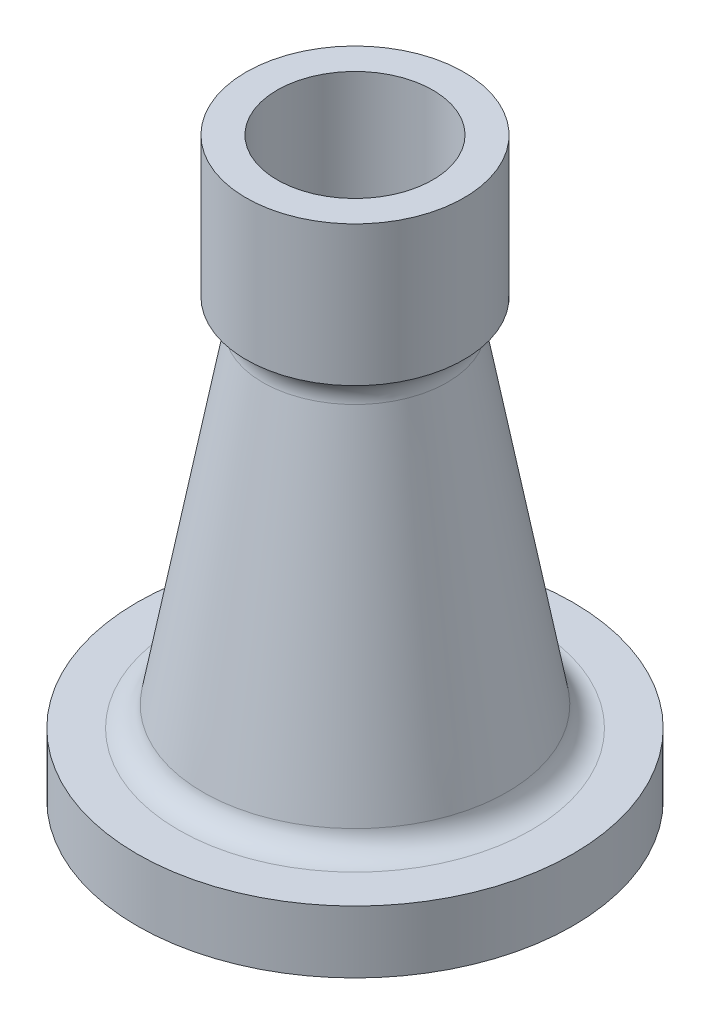
ISO-10303-21;
HEADER;
FILE_DESCRIPTION(('STEP AP214'),'2;1');
FILE_NAME('part.step','',(''),(''),'','','');
FILE_SCHEMA(('AUTOMOTIVE_DESIGN { 1 0 10303 214 1 1 1 1 }'));
ENDSEC;
DATA;
#1=APPLICATION_CONTEXT('core data for automotive mechanical design processes');
#2=APPLICATION_PROTOCOL_DEFINITION('international standard','automotive_design',2000,#1);
#3=PRODUCT_CONTEXT('',#1,'mechanical');
#4=PRODUCT('Part','Part','',(#3));
#5=PRODUCT_RELATED_PRODUCT_CATEGORY('part','',(#4));
#6=PRODUCT_DEFINITION_FORMATION('','',#4);
#7=PRODUCT_DEFINITION_CONTEXT('part definition',#1,'design');
#8=PRODUCT_DEFINITION('design','',#6,#7);
#9=PRODUCT_DEFINITION_SHAPE('','',#8);
#10=(LENGTH_UNIT() NAMED_UNIT(*) SI_UNIT(.MILLI.,.METRE.));
#11=(NAMED_UNIT(*) PLANE_ANGLE_UNIT() SI_UNIT($,.RADIAN.));
#12=(NAMED_UNIT(*) SI_UNIT($,.STERADIAN.) SOLID_ANGLE_UNIT());
#13=UNCERTAINTY_MEASURE_WITH_UNIT(LENGTH_MEASURE(1.E-05),#10,'distance_accuracy_value','');
#14=(GEOMETRIC_REPRESENTATION_CONTEXT(3) GLOBAL_UNCERTAINTY_ASSIGNED_CONTEXT((#13)) GLOBAL_UNIT_ASSIGNED_CONTEXT((#10,
#11,#12)) REPRESENTATION_CONTEXT('',''));
#15=CARTESIAN_POINT('',(0.,0.,0.));
#16=DIRECTION('',(0.,0.,1.));
#17=DIRECTION('',(1.,0.,0.));
#18=AXIS2_PLACEMENT_3D('',#15,#16,#17);
#19=CARTESIAN_POINT('',(25.,92.5,0.));
#20=DIRECTION('',(0.,-1.,0.));
#21=DIRECTION('',(1.,0.,0.));
#22=AXIS2_PLACEMENT_3D('',#19,#20,#21);
#23=PLANE('',#22);
#24=CARTESIAN_POINT('',(0.,92.5,0.));
#25=DIRECTION('',(0.,1.,0.));
#26=DIRECTION('',(-1.,0.,0.));
#27=AXIS2_PLACEMENT_3D('',#24,#25,#26);
#28=CIRCLE('',#27,25.);
#29=CARTESIAN_POINT('',(-25.,92.5,0.));
#30=VERTEX_POINT('',#29);
#31=EDGE_CURVE('E10',#30,#30,#28,.T.);
#32=ORIENTED_EDGE('',*,*,#31,.F.);
#33=EDGE_LOOP('',(#32));
#34=FACE_BOUND('',#33,.T.);
#35=CARTESIAN_POINT('',(0.,92.5,0.));
#36=DIRECTION('',(0.,1.,0.));
#37=DIRECTION('',(-1.,0.,0.));
#38=AXIS2_PLACEMENT_3D('',#35,#36,#37);
#39=CIRCLE('',#38,35.);
#40=CARTESIAN_POINT('',(-35.,92.5,0.));
#41=VERTEX_POINT('',#40);
#42=EDGE_CURVE('E95',#41,#41,#39,.T.);
#43=ORIENTED_EDGE('',*,*,#42,.T.);
#44=EDGE_LOOP('',(#43));
#45=FACE_BOUND('',#44,.T.);
#46=ADVANCED_FACE('F40',(#34,#45),#23,.F.);
#47=CARTESIAN_POINT('',(0.,92.5,0.));
#48=DIRECTION('',(0.,1.,0.));
#49=DIRECTION('',(-1.,0.,0.));
#50=AXIS2_PLACEMENT_3D('',#47,#48,#49);
#51=CYLINDRICAL_SURFACE('',#50,25.);
#52=CARTESIAN_POINT('',(0.,8.21170713984311,0.));
#53=DIRECTION('',(0.,1.,0.));
#54=DIRECTION('',(-1.,0.,0.));
#55=AXIS2_PLACEMENT_3D('',#52,#53,#54);
#56=CIRCLE('',#55,25.);
#57=CARTESIAN_POINT('',(-25.,8.21170713984311,0.));
#58=VERTEX_POINT('',#57);
#59=EDGE_CURVE('E47',#58,#58,#56,.T.);
#60=ORIENTED_EDGE('',*,*,#59,.F.);
#61=EDGE_LOOP('',(#60));
#62=FACE_BOUND('',#61,.T.);
#63=ORIENTED_EDGE('',*,*,#31,.T.);
#64=EDGE_LOOP('',(#63));
#65=FACE_BOUND('',#64,.T.);
#66=ADVANCED_FACE('F163',(#62,#65),#51,.F.);
#67=CARTESIAN_POINT('',(0.,8.21170713984311,0.));
#68=DIRECTION('',(0.,-1.,0.));
#69=DIRECTION('',(1.,0.,0.));
#70=AXIS2_PLACEMENT_3D('',#67,#68,#69);
#71=CONICAL_SURFACE('',#70,25.,0.181744020724218);
#72=CARTESIAN_POINT('',(0.,-89.5,0.));
#73=DIRECTION('',(0.,1.,0.));
#74=DIRECTION('',(-1.,0.,0.));
#75=AXIS2_PLACEMENT_3D('',#72,#73,#74);
#76=CIRCLE('',#75,42.9566634528639);
#77=CARTESIAN_POINT('',(-42.9566634528639,-89.5,0.));
#78=VERTEX_POINT('',#77);
#79=EDGE_CURVE('E52',#78,#78,#76,.T.);
#80=ORIENTED_EDGE('',*,*,#79,.F.);
#81=EDGE_LOOP('',(#80));
#82=FACE_BOUND('',#81,.T.);
#83=ORIENTED_EDGE('',*,*,#59,.T.);
#84=EDGE_LOOP('',(#83));
#85=FACE_BOUND('',#84,.T.);
#86=ADVANCED_FACE('F158',(#82,#85),#71,.F.);
#87=CARTESIAN_POINT('',(47.5,-89.5,0.));
#88=DIRECTION('',(0.,1.,0.));
#89=DIRECTION('',(-1.,0.,0.));
#90=AXIS2_PLACEMENT_3D('',#87,#88,#89);
#91=PLANE('',#90);
#92=CARTESIAN_POINT('',(0.,-89.5,0.));
#93=DIRECTION('',(0.,1.,0.));
#94=DIRECTION('',(-1.,0.,0.));
#95=AXIS2_PLACEMENT_3D('',#92,#93,#94);
#96=CIRCLE('',#95,47.5);
#97=CARTESIAN_POINT('',(-47.5,-89.5,0.));
#98=VERTEX_POINT('',#97);
#99=EDGE_CURVE('E57',#98,#98,#96,.T.);
#100=ORIENTED_EDGE('',*,*,#99,.F.);
#101=EDGE_LOOP('',(#100));
#102=FACE_BOUND('',#101,.T.);
#103=ORIENTED_EDGE('',*,*,#79,.T.);
#104=EDGE_LOOP('',(#103));
#105=FACE_BOUND('',#104,.T.);
#106=ADVANCED_FACE('F152',(#102,#105),#91,.F.);
#107=CARTESIAN_POINT('',(0.,-92.,0.));
#108=DIRECTION('',(0.,1.,0.));
#109=DIRECTION('',(-1.,0.,0.));
#110=AXIS2_PLACEMENT_3D('',#107,#108,#109);
#111=TOROIDAL_SURFACE('',#110,47.5,2.5);
#112=CARTESIAN_POINT('',(0.,-92.,0.));
#113=DIRECTION('',(0.,1.,0.));
#114=DIRECTION('',(-1.,0.,0.));
#115=AXIS2_PLACEMENT_3D('',#112,#113,#114);
#116=CIRCLE('',#115,50.);
#117=CARTESIAN_POINT('',(-50.,-92.,0.));
#118=VERTEX_POINT('',#117);
#119=EDGE_CURVE('E63',#118,#118,#116,.T.);
#120=ORIENTED_EDGE('',*,*,#119,.F.);
#121=EDGE_LOOP('',(#120));
#122=FACE_BOUND('',#121,.T.);
#123=ORIENTED_EDGE('',*,*,#99,.T.);
#124=EDGE_LOOP('',(#123));
#125=FACE_BOUND('',#124,.T.);
#126=ADVANCED_FACE('F146',(#122,#125),#111,.F.);
#127=CARTESIAN_POINT('',(0.,92.5,0.));
#128=DIRECTION('',(0.,1.,0.));
#129=DIRECTION('',(-1.,0.,0.));
#130=AXIS2_PLACEMENT_3D('',#127,#128,#129);
#131=CYLINDRICAL_SURFACE('',#130,50.);
#132=CARTESIAN_POINT('',(0.,-92.5,0.));
#133=DIRECTION('',(0.,1.,0.));
#134=DIRECTION('',(-1.,0.,0.));
#135=AXIS2_PLACEMENT_3D('',#132,#133,#134);
#136=CIRCLE('',#135,50.);
#137=CARTESIAN_POINT('',(-50.,-92.5,0.));
#138=VERTEX_POINT('',#137);
#139=EDGE_CURVE('E67',#138,#138,#136,.T.);
#140=ORIENTED_EDGE('',*,*,#139,.F.);
#141=EDGE_LOOP('',(#140));
#142=FACE_BOUND('',#141,.T.);
#143=ORIENTED_EDGE('',*,*,#119,.T.);
#144=EDGE_LOOP('',(#143));
#145=FACE_BOUND('',#144,.T.);
#146=ADVANCED_FACE('F140',(#142,#145),#131,.F.);
#147=CARTESIAN_POINT('',(50.,-92.5,0.));
#148=DIRECTION('',(0.,1.,0.));
#149=DIRECTION('',(-1.,0.,0.));
#150=AXIS2_PLACEMENT_3D('',#147,#148,#149);
#151=PLANE('',#150);
#152=CARTESIAN_POINT('',(0.,-92.5,0.));
#153=DIRECTION('',(0.,1.,0.));
#154=DIRECTION('',(-1.,0.,0.));
#155=AXIS2_PLACEMENT_3D('',#152,#153,#154);
#156=CIRCLE('',#155,70.);
#157=CARTESIAN_POINT('',(-70.,-92.5,0.));
#158=VERTEX_POINT('',#157);
#159=EDGE_CURVE('E71',#158,#158,#156,.T.);
#160=ORIENTED_EDGE('',*,*,#159,.F.);
#161=EDGE_LOOP('',(#160));
#162=FACE_BOUND('',#161,.T.);
#163=ORIENTED_EDGE('',*,*,#139,.T.);
#164=EDGE_LOOP('',(#163));
#165=FACE_BOUND('',#164,.T.);
#166=ADVANCED_FACE('F134',(#162,#165),#151,.F.);
#167=CARTESIAN_POINT('',(0.,92.5,0.));
#168=DIRECTION('',(0.,1.,0.));
#169=DIRECTION('',(-1.,0.,0.));
#170=AXIS2_PLACEMENT_3D('',#167,#168,#169);
#171=CYLINDRICAL_SURFACE('',#170,70.);
#172=CARTESIAN_POINT('',(0.,-72.5,0.));
#173=DIRECTION('',(0.,1.,0.));
#174=DIRECTION('',(-1.,0.,0.));
#175=AXIS2_PLACEMENT_3D('',#172,#173,#174);
#176=CIRCLE('',#175,70.);
#177=CARTESIAN_POINT('',(-70.,-72.5,0.));
#178=VERTEX_POINT('',#177);
#179=EDGE_CURVE('E75',#178,#178,#176,.T.);
#180=ORIENTED_EDGE('',*,*,#179,.F.);
#181=EDGE_LOOP('',(#180));
#182=FACE_BOUND('',#181,.T.);
#183=ORIENTED_EDGE('',*,*,#159,.T.);
#184=EDGE_LOOP('',(#183));
#185=FACE_BOUND('',#184,.T.);
#186=ADVANCED_FACE('F128',(#182,#185),#171,.T.);
#187=CARTESIAN_POINT('',(70.,-72.5,0.));
#188=DIRECTION('',(0.,-1.,0.));
#189=DIRECTION('',(1.,0.,0.));
#190=AXIS2_PLACEMENT_3D('',#187,#188,#189);
#191=PLANE('',#190);
#192=CARTESIAN_POINT('',(0.,-72.5,0.));
#193=DIRECTION('',(0.,1.,0.));
#194=DIRECTION('',(-1.,0.,0.));
#195=AXIS2_PLACEMENT_3D('',#192,#193,#194);
#196=CIRCLE('',#195,56.6637917275261);
#197=CARTESIAN_POINT('',(-56.6637917275261,-72.5,0.));
#198=VERTEX_POINT('',#197);
#199=EDGE_CURVE('E79',#198,#198,#196,.T.);
#200=ORIENTED_EDGE('',*,*,#199,.F.);
#201=EDGE_LOOP('',(#200));
#202=FACE_BOUND('',#201,.T.);
#203=ORIENTED_EDGE('',*,*,#179,.T.);
#204=EDGE_LOOP('',(#203));
#205=FACE_BOUND('',#204,.T.);
#206=ADVANCED_FACE('F122',(#202,#205),#191,.F.);
#207=CARTESIAN_POINT('',(0.,-64.5,0.));
#208=DIRECTION('',(0.,1.,0.));
#209=DIRECTION('',(-1.,0.,0.));
#210=AXIS2_PLACEMENT_3D('',#207,#208,#209);
#211=TOROIDAL_SURFACE('',#210,56.6637917275261,8.);
#212=CARTESIAN_POINT('',(0.,-65.9459611526141,0.));
#213=DIRECTION('',(0.,1.,0.));
#214=DIRECTION('',(-1.,0.,0.));
#215=AXIS2_PLACEMENT_3D('',#212,#213,#214);
#216=CIRCLE('',#215,48.7955520041107);
#217=CARTESIAN_POINT('',(-48.7955520041107,-65.9459611526141,0.));
#218=VERTEX_POINT('',#217);
#219=EDGE_CURVE('E83',#218,#218,#216,.T.);
#220=ORIENTED_EDGE('',*,*,#219,.F.);
#221=EDGE_LOOP('',(#220));
#222=FACE_BOUND('',#221,.T.);
#223=ORIENTED_EDGE('',*,*,#199,.T.);
#224=EDGE_LOOP('',(#223));
#225=FACE_BOUND('',#224,.T.);
#226=ADVANCED_FACE('F116',(#222,#225),#211,.F.);
#227=CARTESIAN_POINT('',(0.,-65.9459611526141,0.));
#228=DIRECTION('',(0.,-1.,0.));
#229=DIRECTION('',(1.,0.,0.));
#230=AXIS2_PLACEMENT_3D('',#227,#228,#229);
#231=CONICAL_SURFACE('',#230,48.7955520041107,0.181744020724217);
#232=CARTESIAN_POINT('',(0.,38.4478668206908,0.));
#233=DIRECTION('',(0.,1.,0.));
#234=DIRECTION('',(-1.,0.,0.));
#235=AXIS2_PLACEMENT_3D('',#232,#233,#234);
#236=CIRCLE('',#235,29.6109026888556);
#237=CARTESIAN_POINT('',(-29.6109026888556,38.4478668206908,0.));
#238=VERTEX_POINT('',#237);
#239=EDGE_CURVE('E87',#238,#238,#236,.T.);
#240=ORIENTED_EDGE('',*,*,#239,.F.);
#241=EDGE_LOOP('',(#240));
#242=FACE_BOUND('',#241,.T.);
#243=ORIENTED_EDGE('',*,*,#219,.T.);
#244=EDGE_LOOP('',(#243));
#245=FACE_BOUND('',#244,.T.);
#246=ADVANCED_FACE('F110',(#242,#245),#231,.T.);
#247=CARTESIAN_POINT('',(0.,39.8938279733049,0.));
#248=DIRECTION('',(0.,1.,0.));
#249=DIRECTION('',(-1.,0.,0.));
#250=AXIS2_PLACEMENT_3D('',#247,#248,#249);
#251=TOROIDAL_SURFACE('',#250,37.479142412271,8.);
#252=CARTESIAN_POINT('',(0.,47.5,0.));
#253=DIRECTION('',(0.,1.,0.));
#254=DIRECTION('',(-1.,0.,0.));
#255=AXIS2_PLACEMENT_3D('',#252,#253,#254);
#256=CIRCLE('',#255,35.);
#257=CARTESIAN_POINT('',(-35.,47.5,0.));
#258=VERTEX_POINT('',#257);
#259=EDGE_CURVE('E91',#258,#258,#256,.T.);
#260=ORIENTED_EDGE('',*,*,#259,.F.);
#261=EDGE_LOOP('',(#260));
#262=FACE_BOUND('',#261,.T.);
#263=ORIENTED_EDGE('',*,*,#239,.T.);
#264=EDGE_LOOP('',(#263));
#265=FACE_BOUND('',#264,.T.);
#266=ADVANCED_FACE('F104',(#262,#265),#251,.F.);
#267=CARTESIAN_POINT('',(0.,92.5,0.));
#268=DIRECTION('',(0.,1.,0.));
#269=DIRECTION('',(-1.,0.,0.));
#270=AXIS2_PLACEMENT_3D('',#267,#268,#269);
#271=CYLINDRICAL_SURFACE('',#270,35.);
#272=ORIENTED_EDGE('',*,*,#42,.F.);
#273=EDGE_LOOP('',(#272));
#274=FACE_BOUND('',#273,.T.);
#275=ORIENTED_EDGE('',*,*,#259,.T.);
#276=EDGE_LOOP('',(#275));
#277=FACE_BOUND('',#276,.T.);
#278=ADVANCED_FACE('F101',(#274,#277),#271,.T.);
#279=CLOSED_SHELL('',(#46,#66,#86,#106,#126,#146,#166,#186,#206,#226,#246,#266,#278));
#280=MANIFOLD_SOLID_BREP('B2',#279);
#281=ADVANCED_BREP_SHAPE_REPRESENTATION('',(#18,#280),#14);
#282=SHAPE_DEFINITION_REPRESENTATION(#9,#281);
ENDSEC;
END-ISO-10303-21;
